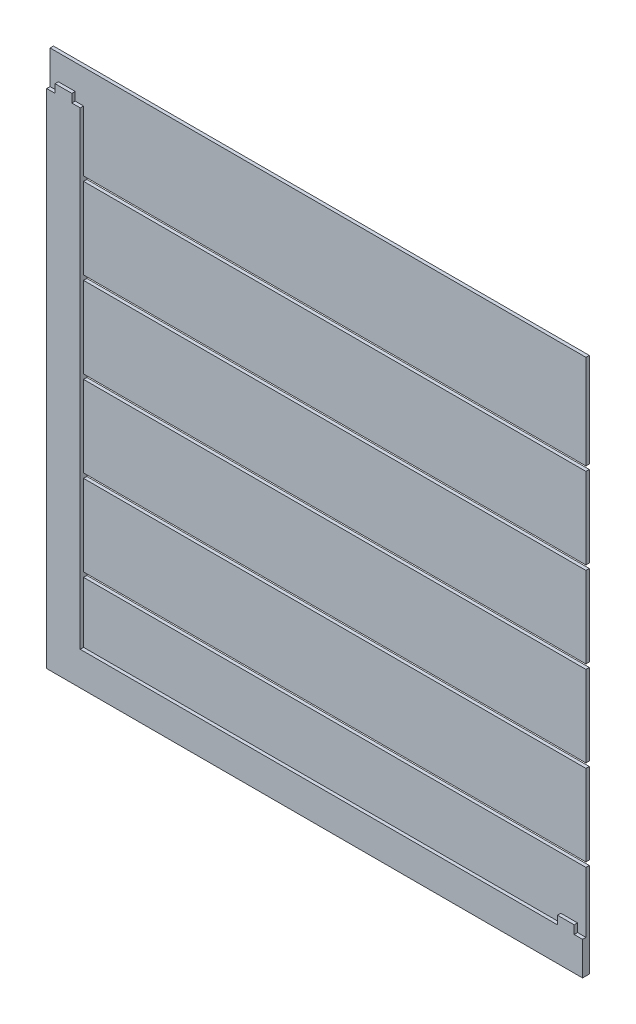
ISO-10303-21;
HEADER;
FILE_DESCRIPTION(('STEP AP214'),'2;1');
FILE_NAME('part.step','',(''),(''),'','','');
FILE_SCHEMA(('AUTOMOTIVE_DESIGN { 1 0 10303 214 1 1 1 1 }'));
ENDSEC;
DATA;
#1=APPLICATION_CONTEXT('core data for automotive mechanical design processes');
#2=APPLICATION_PROTOCOL_DEFINITION('international standard','automotive_design',2000,#1);
#3=PRODUCT_CONTEXT('',#1,'mechanical');
#4=PRODUCT('Part','Part','',(#3));
#5=PRODUCT_RELATED_PRODUCT_CATEGORY('part','',(#4));
#6=PRODUCT_DEFINITION_FORMATION('','',#4);
#7=PRODUCT_DEFINITION_CONTEXT('part definition',#1,'design');
#8=PRODUCT_DEFINITION('design','',#6,#7);
#9=PRODUCT_DEFINITION_SHAPE('','',#8);
#10=(LENGTH_UNIT() NAMED_UNIT(*) SI_UNIT(.MILLI.,.METRE.));
#11=(NAMED_UNIT(*) PLANE_ANGLE_UNIT() SI_UNIT($,.RADIAN.));
#12=(NAMED_UNIT(*) SI_UNIT($,.STERADIAN.) SOLID_ANGLE_UNIT());
#13=UNCERTAINTY_MEASURE_WITH_UNIT(LENGTH_MEASURE(1.E-05),#10,'distance_accuracy_value','');
#14=(GEOMETRIC_REPRESENTATION_CONTEXT(3) GLOBAL_UNCERTAINTY_ASSIGNED_CONTEXT((#13)) GLOBAL_UNIT_ASSIGNED_CONTEXT((#10,
#11,#12)) REPRESENTATION_CONTEXT('',''));
#15=CARTESIAN_POINT('',(0.,0.,0.));
#16=DIRECTION('',(0.,0.,1.));
#17=DIRECTION('',(1.,0.,0.));
#18=AXIS2_PLACEMENT_3D('',#15,#16,#17);
#19=CARTESIAN_POINT('',(0.,0.,1.));
#20=DIRECTION('',(0.,0.,1.));
#21=DIRECTION('',(1.,0.,0.));
#22=AXIS2_PLACEMENT_3D('',#19,#20,#21);
#23=PLANE('',#22);
#24=DIRECTION('',(0.,1.,0.));
#25=VECTOR('',#24,1.);
#26=CARTESIAN_POINT('',(-75.,-70.0313827048751,1.));
#27=LINE('',#26,#25);
#28=CARTESIAN_POINT('',(-75.,-50.5313827048751,1.));
#29=VERTEX_POINT('',#28);
#30=CARTESIAN_POINT('',(-75.,-26.3313827048751,1.));
#31=VERTEX_POINT('',#30);
#32=EDGE_CURVE('E11',#29,#31,#27,.T.);
#33=ORIENTED_EDGE('',*,*,#32,.F.);
#34=DIRECTION('',(1.,0.,0.));
#35=VECTOR('',#34,1.);
#36=CARTESIAN_POINT('',(0.,-50.5313827048751,1.));
#37=LINE('',#36,#35);
#38=CARTESIAN_POINT('',(75.,-50.5313827048751,1.));
#39=VERTEX_POINT('',#38);
#40=EDGE_CURVE('E390',#29,#39,#37,.T.);
#41=ORIENTED_EDGE('',*,*,#40,.T.);
#42=DIRECTION('',(0.,-1.,0.));
#43=VECTOR('',#42,1.);
#44=CARTESIAN_POINT('',(75.,0.,1.));
#45=LINE('',#44,#43);
#46=CARTESIAN_POINT('',(75.,-26.3313827048751,1.));
#47=VERTEX_POINT('',#46);
#48=EDGE_CURVE('E393',#47,#39,#45,.T.);
#49=ORIENTED_EDGE('',*,*,#48,.F.);
#50=DIRECTION('',(1.,0.,0.));
#51=VECTOR('',#50,1.);
#52=CARTESIAN_POINT('',(0.,-26.3313827048751,1.));
#53=LINE('',#52,#51);
#54=EDGE_CURVE('E396',#31,#47,#53,.T.);
#55=ORIENTED_EDGE('',*,*,#54,.F.);
#56=EDGE_LOOP('',(#33,#41,#49,#55));
#57=FACE_BOUND('',#56,.T.);
#58=ADVANCED_FACE('F39',(#57),#23,.T.);
#59=CARTESIAN_POINT('',(-75.,-24.9313827048751,1.));
#60=VERTEX_POINT('',#59);
#61=CARTESIAN_POINT('',(-75.,-0.731382704875112,1.));
#62=VERTEX_POINT('',#61);
#63=EDGE_CURVE('E48',#60,#62,#27,.T.);
#64=ORIENTED_EDGE('',*,*,#63,.F.);
#65=DIRECTION('',(1.,0.,0.));
#66=VECTOR('',#65,1.);
#67=CARTESIAN_POINT('',(0.,-24.9313827048751,1.));
#68=LINE('',#67,#66);
#69=CARTESIAN_POINT('',(75.,-24.9313827048751,1.));
#70=VERTEX_POINT('',#69);
#71=EDGE_CURVE('E399',#60,#70,#68,.T.);
#72=ORIENTED_EDGE('',*,*,#71,.T.);
#73=DIRECTION('',(0.,-1.,0.));
#74=VECTOR('',#73,1.);
#75=CARTESIAN_POINT('',(75.,0.,1.));
#76=LINE('',#75,#74);
#77=CARTESIAN_POINT('',(75.,-0.731382704875112,1.));
#78=VERTEX_POINT('',#77);
#79=EDGE_CURVE('E401',#78,#70,#76,.T.);
#80=ORIENTED_EDGE('',*,*,#79,.F.);
#81=DIRECTION('',(1.,0.,0.));
#82=VECTOR('',#81,1.);
#83=CARTESIAN_POINT('',(0.,-0.731382704875112,1.));
#84=LINE('',#83,#82);
#85=EDGE_CURVE('E404',#62,#78,#84,.T.);
#86=ORIENTED_EDGE('',*,*,#85,.F.);
#87=EDGE_LOOP('',(#64,#72,#80,#86));
#88=FACE_BOUND('',#87,.T.);
#89=ADVANCED_FACE('F562',(#88),#23,.T.);
#90=CARTESIAN_POINT('',(-75.,0.668617295124886,1.));
#91=VERTEX_POINT('',#90);
#92=CARTESIAN_POINT('',(-75.,24.8686172951249,1.));
#93=VERTEX_POINT('',#92);
#94=EDGE_CURVE('E551',#91,#93,#27,.T.);
#95=ORIENTED_EDGE('',*,*,#94,.F.);
#96=DIRECTION('',(1.,0.,0.));
#97=VECTOR('',#96,1.);
#98=CARTESIAN_POINT('',(0.,0.668617295124886,1.));
#99=LINE('',#98,#97);
#100=CARTESIAN_POINT('',(75.,0.668617295124886,1.));
#101=VERTEX_POINT('',#100);
#102=EDGE_CURVE('E407',#91,#101,#99,.T.);
#103=ORIENTED_EDGE('',*,*,#102,.T.);
#104=DIRECTION('',(0.,-1.,0.));
#105=VECTOR('',#104,1.);
#106=CARTESIAN_POINT('',(75.,0.,1.));
#107=LINE('',#106,#105);
#108=CARTESIAN_POINT('',(75.,24.8686172951249,1.));
#109=VERTEX_POINT('',#108);
#110=EDGE_CURVE('E409',#109,#101,#107,.T.);
#111=ORIENTED_EDGE('',*,*,#110,.F.);
#112=DIRECTION('',(1.,0.,0.));
#113=VECTOR('',#112,1.);
#114=CARTESIAN_POINT('',(0.,24.8686172951249,1.));
#115=LINE('',#114,#113);
#116=EDGE_CURVE('E412',#93,#109,#115,.T.);
#117=ORIENTED_EDGE('',*,*,#116,.F.);
#118=EDGE_LOOP('',(#95,#103,#111,#117));
#119=FACE_BOUND('',#118,.T.);
#120=ADVANCED_FACE('F579',(#119),#23,.T.);
#121=CARTESIAN_POINT('',(-75.,26.2686172951249,1.));
#122=VERTEX_POINT('',#121);
#123=CARTESIAN_POINT('',(-75.,50.4686172951249,1.));
#124=VERTEX_POINT('',#123);
#125=EDGE_CURVE('E547',#122,#124,#27,.T.);
#126=ORIENTED_EDGE('',*,*,#125,.F.);
#127=DIRECTION('',(1.,0.,0.));
#128=VECTOR('',#127,1.);
#129=CARTESIAN_POINT('',(0.,26.2686172951249,1.));
#130=LINE('',#129,#128);
#131=CARTESIAN_POINT('',(75.,26.2686172951249,1.));
#132=VERTEX_POINT('',#131);
#133=EDGE_CURVE('E415',#122,#132,#130,.T.);
#134=ORIENTED_EDGE('',*,*,#133,.T.);
#135=DIRECTION('',(0.,-1.,0.));
#136=VECTOR('',#135,1.);
#137=CARTESIAN_POINT('',(75.,0.,1.));
#138=LINE('',#137,#136);
#139=CARTESIAN_POINT('',(75.,50.4686172951249,1.));
#140=VERTEX_POINT('',#139);
#141=EDGE_CURVE('E417',#140,#132,#138,.T.);
#142=ORIENTED_EDGE('',*,*,#141,.F.);
#143=DIRECTION('',(1.,0.,0.));
#144=VECTOR('',#143,1.);
#145=CARTESIAN_POINT('',(0.,50.4686172951249,1.));
#146=LINE('',#145,#144);
#147=EDGE_CURVE('E420',#124,#140,#146,.T.);
#148=ORIENTED_EDGE('',*,*,#147,.F.);
#149=EDGE_LOOP('',(#126,#134,#142,#148));
#150=FACE_BOUND('',#149,.T.);
#151=ADVANCED_FACE('F594',(#150),#23,.T.);
#152=DIRECTION('',(-1.,0.,0.));
#153=VECTOR('',#152,1.);
#154=CARTESIAN_POINT('',(-85.,69.9686172951249,1.));
#155=LINE('',#154,#153);
#156=CARTESIAN_POINT('',(-82.5,69.9686172951249,1.));
#157=VERTEX_POINT('',#156);
#158=CARTESIAN_POINT('',(-85.,69.9686172951249,1.));
#159=VERTEX_POINT('',#158);
#160=EDGE_CURVE('E57',#157,#159,#155,.T.);
#161=ORIENTED_EDGE('',*,*,#160,.F.);
#162=DIRECTION('',(0.,-1.,0.));
#163=VECTOR('',#162,1.);
#164=CARTESIAN_POINT('',(-82.5,69.9686172951249,1.));
#165=LINE('',#164,#163);
#166=CARTESIAN_POINT('',(-82.5,72.468617295125,1.));
#167=VERTEX_POINT('',#166);
#168=EDGE_CURVE('E61',#167,#157,#165,.T.);
#169=ORIENTED_EDGE('',*,*,#168,.F.);
#170=DIRECTION('',(-1.,0.,0.));
#171=VECTOR('',#170,1.);
#172=CARTESIAN_POINT('',(-82.5,72.468617295125,1.));
#173=LINE('',#172,#171);
#174=CARTESIAN_POINT('',(-77.5,72.468617295125,1.));
#175=VERTEX_POINT('',#174);
#176=EDGE_CURVE('E350',#175,#167,#173,.T.);
#177=ORIENTED_EDGE('',*,*,#176,.F.);
#178=DIRECTION('',(0.,1.,0.));
#179=VECTOR('',#178,1.);
#180=CARTESIAN_POINT('',(-77.5,69.9686172951249,1.));
#181=LINE('',#180,#179);
#182=CARTESIAN_POINT('',(-77.5,69.9686172951249,1.));
#183=VERTEX_POINT('',#182);
#184=EDGE_CURVE('E347',#183,#175,#181,.T.);
#185=ORIENTED_EDGE('',*,*,#184,.F.);
#186=DIRECTION('',(-1.,0.,0.));
#187=VECTOR('',#186,1.);
#188=CARTESIAN_POINT('',(-77.5,69.9686172951249,1.));
#189=LINE('',#188,#187);
#190=CARTESIAN_POINT('',(-75.,69.9686172951249,1.));
#191=VERTEX_POINT('',#190);
#192=EDGE_CURVE('E343',#191,#183,#189,.T.);
#193=ORIENTED_EDGE('',*,*,#192,.F.);
#194=CARTESIAN_POINT('',(-75.,51.8686172951249,1.));
#195=VERTEX_POINT('',#194);
#196=EDGE_CURVE('E344',#195,#191,#27,.T.);
#197=ORIENTED_EDGE('',*,*,#196,.F.);
#198=DIRECTION('',(1.,0.,0.));
#199=VECTOR('',#198,1.);
#200=CARTESIAN_POINT('',(0.,51.8686172951249,1.));
#201=LINE('',#200,#199);
#202=CARTESIAN_POINT('',(75.,51.8686172951249,1.));
#203=VERTEX_POINT('',#202);
#204=EDGE_CURVE('E423',#195,#203,#201,.T.);
#205=ORIENTED_EDGE('',*,*,#204,.T.);
#206=DIRECTION('',(0.,-1.,0.));
#207=VECTOR('',#206,1.);
#208=CARTESIAN_POINT('',(75.,0.,1.));
#209=LINE('',#208,#207);
#210=CARTESIAN_POINT('',(75.,79.9686172951249,1.));
#211=VERTEX_POINT('',#210);
#212=EDGE_CURVE('E425',#211,#203,#209,.T.);
#213=ORIENTED_EDGE('',*,*,#212,.F.);
#214=DIRECTION('',(-1.,0.,0.));
#215=VECTOR('',#214,1.);
#216=CARTESIAN_POINT('',(0.,79.9686172951249,1.));
#217=LINE('',#216,#215);
#218=CARTESIAN_POINT('',(-85.,79.9686172951249,1.));
#219=VERTEX_POINT('',#218);
#220=EDGE_CURVE('E428',#211,#219,#217,.T.);
#221=ORIENTED_EDGE('',*,*,#220,.T.);
#222=DIRECTION('',(0.,-1.,0.));
#223=VECTOR('',#222,1.);
#224=CARTESIAN_POINT('',(-85.,0.,1.));
#225=LINE('',#224,#223);
#226=EDGE_CURVE('E430',#219,#159,#225,.T.);
#227=ORIENTED_EDGE('',*,*,#226,.T.);
#228=EDGE_LOOP('',(#161,#169,#177,#185,#193,#197,#205,#213,#221,#227));
#229=FACE_BOUND('',#228,.T.);
#230=ADVANCED_FACE('F608',(#229),#23,.T.);
#231=CARTESIAN_POINT('',(0.,-51.9313827048751,1.));
#232=DIRECTION('',(0.,1.,0.));
#233=DIRECTION('',(0.,0.,1.));
#234=AXIS2_PLACEMENT_3D('',#231,#232,#233);
#235=PLANE('',#234);
#236=DIRECTION('',(1.,0.,0.));
#237=VECTOR('',#236,1.);
#238=CARTESIAN_POINT('',(0.,-51.9313827048751,0.));
#239=LINE('',#238,#237);
#240=CARTESIAN_POINT('',(-75.,-51.9313827048751,0.));
#241=VERTEX_POINT('',#240);
#242=CARTESIAN_POINT('',(75.,-51.9313827048751,0.));
#243=VERTEX_POINT('',#242);
#244=EDGE_CURVE('E386',#241,#243,#239,.T.);
#245=ORIENTED_EDGE('',*,*,#244,.F.);
#246=DIRECTION('',(0.,0.,-1.));
#247=VECTOR('',#246,1.);
#248=CARTESIAN_POINT('',(-75.,-51.9313827048751,1.));
#249=LINE('',#248,#247);
#250=CARTESIAN_POINT('',(-75.,-51.9313827048751,1.));
#251=VERTEX_POINT('',#250);
#252=EDGE_CURVE('E43',#251,#241,#249,.T.);
#253=ORIENTED_EDGE('',*,*,#252,.F.);
#254=DIRECTION('',(1.,0.,0.));
#255=VECTOR('',#254,1.);
#256=CARTESIAN_POINT('',(0.,-51.9313827048751,1.));
#257=LINE('',#256,#255);
#258=CARTESIAN_POINT('',(75.,-51.9313827048751,1.));
#259=VERTEX_POINT('',#258);
#260=EDGE_CURVE('E387',#251,#259,#257,.T.);
#261=ORIENTED_EDGE('',*,*,#260,.T.);
#262=DIRECTION('',(0.,0.,-1.));
#263=VECTOR('',#262,1.);
#264=CARTESIAN_POINT('',(75.,-51.9313827048751,1.));
#265=LINE('',#264,#263);
#266=EDGE_CURVE('E285',#259,#243,#265,.T.);
#267=ORIENTED_EDGE('',*,*,#266,.T.);
#268=EDGE_LOOP('',(#245,#253,#261,#267));
#269=FACE_BOUND('',#268,.T.);
#270=ADVANCED_FACE('F41',(#269),#235,.T.);
#271=CARTESIAN_POINT('',(0.,-50.5313827048751,1.));
#272=DIRECTION('',(0.,1.,0.));
#273=DIRECTION('',(0.,0.,1.));
#274=AXIS2_PLACEMENT_3D('',#271,#272,#273);
#275=PLANE('',#274);
#276=DIRECTION('',(1.,0.,0.));
#277=VECTOR('',#276,1.);
#278=CARTESIAN_POINT('',(0.,-50.5313827048751,0.));
#279=LINE('',#278,#277);
#280=CARTESIAN_POINT('',(-75.,-50.5313827048751,0.));
#281=VERTEX_POINT('',#280);
#282=CARTESIAN_POINT('',(75.,-50.5313827048751,0.));
#283=VERTEX_POINT('',#282);
#284=EDGE_CURVE('E438',#281,#283,#279,.T.);
#285=ORIENTED_EDGE('',*,*,#284,.T.);
#286=DIRECTION('',(0.,0.,-1.));
#287=VECTOR('',#286,1.);
#288=CARTESIAN_POINT('',(75.,-50.5313827048751,1.));
#289=LINE('',#288,#287);
#290=EDGE_CURVE('E537',#39,#283,#289,.T.);
#291=ORIENTED_EDGE('',*,*,#290,.F.);
#292=ORIENTED_EDGE('',*,*,#40,.F.);
#293=DIRECTION('',(0.,0.,-1.));
#294=VECTOR('',#293,1.);
#295=CARTESIAN_POINT('',(-75.,-50.5313827048751,1.));
#296=LINE('',#295,#294);
#297=EDGE_CURVE('E538',#29,#281,#296,.T.);
#298=ORIENTED_EDGE('',*,*,#297,.T.);
#299=EDGE_LOOP('',(#285,#291,#292,#298));
#300=FACE_BOUND('',#299,.T.);
#301=ADVANCED_FACE('F646',(#300),#275,.F.);
#302=CARTESIAN_POINT('',(75.,0.,1.));
#303=DIRECTION('',(1.,0.,0.));
#304=DIRECTION('',(0.,0.,-1.));
#305=AXIS2_PLACEMENT_3D('',#302,#303,#304);
#306=PLANE('',#305);
#307=DIRECTION('',(0.,-1.,0.));
#308=VECTOR('',#307,1.);
#309=CARTESIAN_POINT('',(75.,0.,0.));
#310=LINE('',#309,#308);
#311=CARTESIAN_POINT('',(75.,-26.3313827048751,0.));
#312=VERTEX_POINT('',#311);
#313=EDGE_CURVE('E441',#312,#283,#310,.T.);
#314=ORIENTED_EDGE('',*,*,#313,.F.);
#315=DIRECTION('',(0.,0.,-1.));
#316=VECTOR('',#315,1.);
#317=CARTESIAN_POINT('',(75.,-26.3313827048751,1.));
#318=LINE('',#317,#316);
#319=EDGE_CURVE('E535',#47,#312,#318,.T.);
#320=ORIENTED_EDGE('',*,*,#319,.F.);
#321=ORIENTED_EDGE('',*,*,#48,.T.);
#322=ORIENTED_EDGE('',*,*,#290,.T.);
#323=EDGE_LOOP('',(#314,#320,#321,#322));
#324=FACE_BOUND('',#323,.T.);
#325=ADVANCED_FACE('F772',(#324),#306,.T.);
#326=CARTESIAN_POINT('',(0.,-26.3313827048751,1.));
#327=DIRECTION('',(0.,1.,0.));
#328=DIRECTION('',(0.,0.,1.));
#329=AXIS2_PLACEMENT_3D('',#326,#327,#328);
#330=PLANE('',#329);
#331=DIRECTION('',(1.,0.,0.));
#332=VECTOR('',#331,1.);
#333=CARTESIAN_POINT('',(0.,-26.3313827048751,0.));
#334=LINE('',#333,#332);
#335=CARTESIAN_POINT('',(-75.,-26.3313827048751,0.));
#336=VERTEX_POINT('',#335);
#337=EDGE_CURVE('E444',#336,#312,#334,.T.);
#338=ORIENTED_EDGE('',*,*,#337,.F.);
#339=DIRECTION('',(0.,0.,-1.));
#340=VECTOR('',#339,1.);
#341=CARTESIAN_POINT('',(-75.,-26.3313827048751,1.));
#342=LINE('',#341,#340);
#343=EDGE_CURVE('E533',#31,#336,#342,.T.);
#344=ORIENTED_EDGE('',*,*,#343,.F.);
#345=ORIENTED_EDGE('',*,*,#54,.T.);
#346=ORIENTED_EDGE('',*,*,#319,.T.);
#347=EDGE_LOOP('',(#338,#344,#345,#346));
#348=FACE_BOUND('',#347,.T.);
#349=ADVANCED_FACE('F652',(#348),#330,.T.);
#350=CARTESIAN_POINT('',(0.,-24.9313827048751,1.));
#351=DIRECTION('',(0.,1.,0.));
#352=DIRECTION('',(0.,0.,1.));
#353=AXIS2_PLACEMENT_3D('',#350,#351,#352);
#354=PLANE('',#353);
#355=DIRECTION('',(1.,0.,0.));
#356=VECTOR('',#355,1.);
#357=CARTESIAN_POINT('',(0.,-24.9313827048751,0.));
#358=LINE('',#357,#356);
#359=CARTESIAN_POINT('',(-75.,-24.9313827048751,0.));
#360=VERTEX_POINT('',#359);
#361=CARTESIAN_POINT('',(75.,-24.9313827048751,0.));
#362=VERTEX_POINT('',#361);
#363=EDGE_CURVE('E449',#360,#362,#358,.T.);
#364=ORIENTED_EDGE('',*,*,#363,.T.);
#365=DIRECTION('',(0.,0.,-1.));
#366=VECTOR('',#365,1.);
#367=CARTESIAN_POINT('',(75.,-24.9313827048751,1.));
#368=LINE('',#367,#366);
#369=EDGE_CURVE('E528',#70,#362,#368,.T.);
#370=ORIENTED_EDGE('',*,*,#369,.F.);
#371=ORIENTED_EDGE('',*,*,#71,.F.);
#372=DIRECTION('',(0.,0.,-1.));
#373=VECTOR('',#372,1.);
#374=CARTESIAN_POINT('',(-75.,-24.9313827048751,1.));
#375=LINE('',#374,#373);
#376=EDGE_CURVE('E530',#60,#360,#375,.T.);
#377=ORIENTED_EDGE('',*,*,#376,.T.);
#378=EDGE_LOOP('',(#364,#370,#371,#377));
#379=FACE_BOUND('',#378,.T.);
#380=ADVANCED_FACE('F656',(#379),#354,.F.);
#381=CARTESIAN_POINT('',(75.,0.,1.));
#382=DIRECTION('',(1.,0.,0.));
#383=DIRECTION('',(0.,1.,0.));
#384=AXIS2_PLACEMENT_3D('',#381,#382,#383);
#385=PLANE('',#384);
#386=DIRECTION('',(0.,-1.,0.));
#387=VECTOR('',#386,1.);
#388=CARTESIAN_POINT('',(75.,0.,0.));
#389=LINE('',#388,#387);
#390=CARTESIAN_POINT('',(75.,-0.731382704875112,0.));
#391=VERTEX_POINT('',#390);
#392=EDGE_CURVE('E452',#391,#362,#389,.T.);
#393=ORIENTED_EDGE('',*,*,#392,.F.);
#394=DIRECTION('',(0.,0.,-1.));
#395=VECTOR('',#394,1.);
#396=CARTESIAN_POINT('',(75.,-0.731382704875112,1.));
#397=LINE('',#396,#395);
#398=EDGE_CURVE('E526',#78,#391,#397,.T.);
#399=ORIENTED_EDGE('',*,*,#398,.F.);
#400=ORIENTED_EDGE('',*,*,#79,.T.);
#401=ORIENTED_EDGE('',*,*,#369,.T.);
#402=EDGE_LOOP('',(#393,#399,#400,#401));
#403=FACE_BOUND('',#402,.T.);
#404=ADVANCED_FACE('F658',(#403),#385,.T.);
#405=CARTESIAN_POINT('',(0.,-0.731382704875112,1.));
#406=DIRECTION('',(0.,1.,0.));
#407=DIRECTION('',(0.,0.,1.));
#408=AXIS2_PLACEMENT_3D('',#405,#406,#407);
#409=PLANE('',#408);
#410=DIRECTION('',(1.,0.,0.));
#411=VECTOR('',#410,1.);
#412=CARTESIAN_POINT('',(0.,-0.731382704875112,0.));
#413=LINE('',#412,#411);
#414=CARTESIAN_POINT('',(-75.,-0.731382704875112,0.));
#415=VERTEX_POINT('',#414);
#416=EDGE_CURVE('E455',#415,#391,#413,.T.);
#417=ORIENTED_EDGE('',*,*,#416,.F.);
#418=DIRECTION('',(0.,0.,-1.));
#419=VECTOR('',#418,1.);
#420=CARTESIAN_POINT('',(-75.,-0.731382704875112,1.));
#421=LINE('',#420,#419);
#422=EDGE_CURVE('E524',#62,#415,#421,.T.);
#423=ORIENTED_EDGE('',*,*,#422,.F.);
#424=ORIENTED_EDGE('',*,*,#85,.T.);
#425=ORIENTED_EDGE('',*,*,#398,.T.);
#426=EDGE_LOOP('',(#417,#423,#424,#425));
#427=FACE_BOUND('',#426,.T.);
#428=ADVANCED_FACE('F567',(#427),#409,.T.);
#429=CARTESIAN_POINT('',(0.,0.668617295124886,1.));
#430=DIRECTION('',(0.,1.,0.));
#431=DIRECTION('',(0.,0.,1.));
#432=AXIS2_PLACEMENT_3D('',#429,#430,#431);
#433=PLANE('',#432);
#434=DIRECTION('',(1.,0.,0.));
#435=VECTOR('',#434,1.);
#436=CARTESIAN_POINT('',(0.,0.668617295124886,0.));
#437=LINE('',#436,#435);
#438=CARTESIAN_POINT('',(-75.,0.668617295124886,0.));
#439=VERTEX_POINT('',#438);
#440=CARTESIAN_POINT('',(75.,0.668617295124886,0.));
#441=VERTEX_POINT('',#440);
#442=EDGE_CURVE('E460',#439,#441,#437,.T.);
#443=ORIENTED_EDGE('',*,*,#442,.T.);
#444=DIRECTION('',(0.,0.,-1.));
#445=VECTOR('',#444,1.);
#446=CARTESIAN_POINT('',(75.,0.668617295124886,1.));
#447=LINE('',#446,#445);
#448=EDGE_CURVE('E519',#101,#441,#447,.T.);
#449=ORIENTED_EDGE('',*,*,#448,.F.);
#450=ORIENTED_EDGE('',*,*,#102,.F.);
#451=DIRECTION('',(0.,0.,-1.));
#452=VECTOR('',#451,1.);
#453=CARTESIAN_POINT('',(-75.,0.668617295124886,1.));
#454=LINE('',#453,#452);
#455=EDGE_CURVE('E521',#91,#439,#454,.T.);
#456=ORIENTED_EDGE('',*,*,#455,.T.);
#457=EDGE_LOOP('',(#443,#449,#450,#456));
#458=FACE_BOUND('',#457,.T.);
#459=ADVANCED_FACE('F575',(#458),#433,.F.);
#460=CARTESIAN_POINT('',(75.,0.,1.));
#461=DIRECTION('',(1.,0.,0.));
#462=DIRECTION('',(0.,0.,-1.));
#463=AXIS2_PLACEMENT_3D('',#460,#461,#462);
#464=PLANE('',#463);
#465=DIRECTION('',(0.,-1.,0.));
#466=VECTOR('',#465,1.);
#467=CARTESIAN_POINT('',(75.,0.,0.));
#468=LINE('',#467,#466);
#469=CARTESIAN_POINT('',(75.,24.8686172951249,0.));
#470=VERTEX_POINT('',#469);
#471=EDGE_CURVE('E463',#470,#441,#468,.T.);
#472=ORIENTED_EDGE('',*,*,#471,.F.);
#473=DIRECTION('',(0.,0.,-1.));
#474=VECTOR('',#473,1.);
#475=CARTESIAN_POINT('',(75.,24.8686172951249,1.));
#476=LINE('',#475,#474);
#477=EDGE_CURVE('E517',#109,#470,#476,.T.);
#478=ORIENTED_EDGE('',*,*,#477,.F.);
#479=ORIENTED_EDGE('',*,*,#110,.T.);
#480=ORIENTED_EDGE('',*,*,#448,.T.);
#481=EDGE_LOOP('',(#472,#478,#479,#480));
#482=FACE_BOUND('',#481,.T.);
#483=ADVANCED_FACE('F752',(#482),#464,.T.);
#484=CARTESIAN_POINT('',(0.,24.8686172951249,1.));
#485=DIRECTION('',(0.,1.,0.));
#486=DIRECTION('',(0.,0.,1.));
#487=AXIS2_PLACEMENT_3D('',#484,#485,#486);
#488=PLANE('',#487);
#489=DIRECTION('',(1.,0.,0.));
#490=VECTOR('',#489,1.);
#491=CARTESIAN_POINT('',(0.,24.8686172951249,0.));
#492=LINE('',#491,#490);
#493=CARTESIAN_POINT('',(-75.,24.8686172951249,0.));
#494=VERTEX_POINT('',#493);
#495=EDGE_CURVE('E466',#494,#470,#492,.T.);
#496=ORIENTED_EDGE('',*,*,#495,.F.);
#497=DIRECTION('',(0.,0.,-1.));
#498=VECTOR('',#497,1.);
#499=CARTESIAN_POINT('',(-75.,24.8686172951249,1.));
#500=LINE('',#499,#498);
#501=EDGE_CURVE('E515',#93,#494,#500,.T.);
#502=ORIENTED_EDGE('',*,*,#501,.F.);
#503=ORIENTED_EDGE('',*,*,#116,.T.);
#504=ORIENTED_EDGE('',*,*,#477,.T.);
#505=EDGE_LOOP('',(#496,#502,#503,#504));
#506=FACE_BOUND('',#505,.T.);
#507=ADVANCED_FACE('F583',(#506),#488,.T.);
#508=CARTESIAN_POINT('',(0.,26.2686172951249,1.));
#509=DIRECTION('',(0.,1.,0.));
#510=DIRECTION('',(0.,0.,1.));
#511=AXIS2_PLACEMENT_3D('',#508,#509,#510);
#512=PLANE('',#511);
#513=DIRECTION('',(1.,0.,0.));
#514=VECTOR('',#513,1.);
#515=CARTESIAN_POINT('',(0.,26.2686172951249,0.));
#516=LINE('',#515,#514);
#517=CARTESIAN_POINT('',(-75.,26.2686172951249,0.));
#518=VERTEX_POINT('',#517);
#519=CARTESIAN_POINT('',(75.,26.2686172951249,0.));
#520=VERTEX_POINT('',#519);
#521=EDGE_CURVE('E471',#518,#520,#516,.T.);
#522=ORIENTED_EDGE('',*,*,#521,.T.);
#523=DIRECTION('',(0.,0.,-1.));
#524=VECTOR('',#523,1.);
#525=CARTESIAN_POINT('',(75.,26.2686172951249,1.));
#526=LINE('',#525,#524);
#527=EDGE_CURVE('E510',#132,#520,#526,.T.);
#528=ORIENTED_EDGE('',*,*,#527,.F.);
#529=ORIENTED_EDGE('',*,*,#133,.F.);
#530=DIRECTION('',(0.,0.,-1.));
#531=VECTOR('',#530,1.);
#532=CARTESIAN_POINT('',(-75.,26.2686172951249,1.));
#533=LINE('',#532,#531);
#534=EDGE_CURVE('E512',#122,#518,#533,.T.);
#535=ORIENTED_EDGE('',*,*,#534,.T.);
#536=EDGE_LOOP('',(#522,#528,#529,#535));
#537=FACE_BOUND('',#536,.T.);
#538=ADVANCED_FACE('F590',(#537),#512,.F.);
#539=CARTESIAN_POINT('',(75.,0.,1.));
#540=DIRECTION('',(1.,0.,0.));
#541=DIRECTION('',(0.,0.,-1.));
#542=AXIS2_PLACEMENT_3D('',#539,#540,#541);
#543=PLANE('',#542);
#544=DIRECTION('',(0.,-1.,0.));
#545=VECTOR('',#544,1.);
#546=CARTESIAN_POINT('',(75.,0.,0.));
#547=LINE('',#546,#545);
#548=CARTESIAN_POINT('',(75.,50.4686172951249,0.));
#549=VERTEX_POINT('',#548);
#550=EDGE_CURVE('E474',#549,#520,#547,.T.);
#551=ORIENTED_EDGE('',*,*,#550,.F.);
#552=DIRECTION('',(0.,0.,-1.));
#553=VECTOR('',#552,1.);
#554=CARTESIAN_POINT('',(75.,50.4686172951249,1.));
#555=LINE('',#554,#553);
#556=EDGE_CURVE('E508',#140,#549,#555,.T.);
#557=ORIENTED_EDGE('',*,*,#556,.F.);
#558=ORIENTED_EDGE('',*,*,#141,.T.);
#559=ORIENTED_EDGE('',*,*,#527,.T.);
#560=EDGE_LOOP('',(#551,#557,#558,#559));
#561=FACE_BOUND('',#560,.T.);
#562=ADVANCED_FACE('F738',(#561),#543,.T.);
#563=CARTESIAN_POINT('',(0.,50.4686172951249,1.));
#564=DIRECTION('',(0.,1.,0.));
#565=DIRECTION('',(0.,0.,1.));
#566=AXIS2_PLACEMENT_3D('',#563,#564,#565);
#567=PLANE('',#566);
#568=DIRECTION('',(1.,0.,0.));
#569=VECTOR('',#568,1.);
#570=CARTESIAN_POINT('',(0.,50.4686172951249,0.));
#571=LINE('',#570,#569);
#572=CARTESIAN_POINT('',(-75.,50.4686172951249,0.));
#573=VERTEX_POINT('',#572);
#574=EDGE_CURVE('E477',#573,#549,#571,.T.);
#575=ORIENTED_EDGE('',*,*,#574,.F.);
#576=DIRECTION('',(0.,0.,-1.));
#577=VECTOR('',#576,1.);
#578=CARTESIAN_POINT('',(-75.,50.4686172951249,1.));
#579=LINE('',#578,#577);
#580=EDGE_CURVE('E506',#124,#573,#579,.T.);
#581=ORIENTED_EDGE('',*,*,#580,.F.);
#582=ORIENTED_EDGE('',*,*,#147,.T.);
#583=ORIENTED_EDGE('',*,*,#556,.T.);
#584=EDGE_LOOP('',(#575,#581,#582,#583));
#585=FACE_BOUND('',#584,.T.);
#586=ADVANCED_FACE('F598',(#585),#567,.T.);
#587=CARTESIAN_POINT('',(-75.,0.,1.));
#588=DIRECTION('',(-1.,0.,0.));
#589=DIRECTION('',(0.,0.,1.));
#590=AXIS2_PLACEMENT_3D('',#587,#588,#589);
#591=PLANE('',#590);
#592=DIRECTION('',(0.,1.,0.));
#593=VECTOR('',#592,1.);
#594=CARTESIAN_POINT('',(-75.,0.,0.));
#595=LINE('',#594,#593);
#596=CARTESIAN_POINT('',(-75.,51.8686172951249,0.));
#597=VERTEX_POINT('',#596);
#598=EDGE_CURVE('E480',#573,#597,#595,.T.);
#599=ORIENTED_EDGE('',*,*,#598,.T.);
#600=DIRECTION('',(0.,0.,-1.));
#601=VECTOR('',#600,1.);
#602=CARTESIAN_POINT('',(-75.,51.8686172951249,1.));
#603=LINE('',#602,#601);
#604=EDGE_CURVE('E503',#195,#597,#603,.T.);
#605=ORIENTED_EDGE('',*,*,#604,.F.);
#606=ORIENTED_EDGE('',*,*,#196,.T.);
#607=DIRECTION('',(0.,0.,-1.));
#608=VECTOR('',#607,1.);
#609=CARTESIAN_POINT('',(-75.,69.9686172951249,2.));
#610=LINE('',#609,#608);
#611=CARTESIAN_POINT('',(-75.,69.9686172951249,2.));
#612=VERTEX_POINT('',#611);
#613=EDGE_CURVE('E367',#612,#191,#610,.T.);
#614=ORIENTED_EDGE('',*,*,#613,.F.);
#615=DIRECTION('',(0.,1.,0.));
#616=VECTOR('',#615,1.);
#617=CARTESIAN_POINT('',(-75.,-70.0313827048751,2.));
#618=LINE('',#617,#616);
#619=CARTESIAN_POINT('',(-75.,-70.0313827048751,2.));
#620=VERTEX_POINT('',#619);
#621=EDGE_CURVE('E313',#620,#612,#618,.T.);
#622=ORIENTED_EDGE('',*,*,#621,.F.);
#623=DIRECTION('',(0.,0.,-1.));
#624=VECTOR('',#623,1.);
#625=CARTESIAN_POINT('',(-75.,-70.0313827048751,2.));
#626=LINE('',#625,#624);
#627=CARTESIAN_POINT('',(-75.,-70.0313827048751,1.));
#628=VERTEX_POINT('',#627);
#629=EDGE_CURVE('E370',#620,#628,#626,.T.);
#630=ORIENTED_EDGE('',*,*,#629,.T.);
#631=EDGE_CURVE('E50',#628,#251,#27,.T.);
#632=ORIENTED_EDGE('',*,*,#631,.T.);
#633=ORIENTED_EDGE('',*,*,#252,.T.);
#634=DIRECTION('',(0.,1.,0.));
#635=VECTOR('',#634,1.);
#636=CARTESIAN_POINT('',(-75.,0.,0.));
#637=LINE('',#636,#635);
#638=EDGE_CURVE('E436',#241,#281,#637,.T.);
#639=ORIENTED_EDGE('',*,*,#638,.T.);
#640=ORIENTED_EDGE('',*,*,#297,.F.);
#641=ORIENTED_EDGE('',*,*,#32,.T.);
#642=ORIENTED_EDGE('',*,*,#343,.T.);
#643=DIRECTION('',(0.,1.,0.));
#644=VECTOR('',#643,1.);
#645=CARTESIAN_POINT('',(-75.,0.,0.));
#646=LINE('',#645,#644);
#647=EDGE_CURVE('E447',#336,#360,#646,.T.);
#648=ORIENTED_EDGE('',*,*,#647,.T.);
#649=ORIENTED_EDGE('',*,*,#376,.F.);
#650=ORIENTED_EDGE('',*,*,#63,.T.);
#651=ORIENTED_EDGE('',*,*,#422,.T.);
#652=DIRECTION('',(0.,1.,0.));
#653=VECTOR('',#652,1.);
#654=CARTESIAN_POINT('',(-75.,0.,0.));
#655=LINE('',#654,#653);
#656=EDGE_CURVE('E458',#415,#439,#655,.T.);
#657=ORIENTED_EDGE('',*,*,#656,.T.);
#658=ORIENTED_EDGE('',*,*,#455,.F.);
#659=ORIENTED_EDGE('',*,*,#94,.T.);
#660=ORIENTED_EDGE('',*,*,#501,.T.);
#661=DIRECTION('',(0.,1.,0.));
#662=VECTOR('',#661,1.);
#663=CARTESIAN_POINT('',(-75.,0.,0.));
#664=LINE('',#663,#662);
#665=EDGE_CURVE('E469',#494,#518,#664,.T.);
#666=ORIENTED_EDGE('',*,*,#665,.T.);
#667=ORIENTED_EDGE('',*,*,#534,.F.);
#668=ORIENTED_EDGE('',*,*,#125,.T.);
#669=ORIENTED_EDGE('',*,*,#580,.T.);
#670=EDGE_LOOP('',(#599,#605,#606,#614,#622,#630,#632,#633,#639,#640,#641,#642,#648,#649,#650,
#651,#657,#658,#659,#660,#666,#667,#668,#669));
#671=FACE_BOUND('',#670,.T.);
#672=ADVANCED_FACE('F557',(#671),#591,.F.);
#673=CARTESIAN_POINT('',(0.,51.8686172951249,1.));
#674=DIRECTION('',(0.,1.,0.));
#675=DIRECTION('',(0.,0.,1.));
#676=AXIS2_PLACEMENT_3D('',#673,#674,#675);
#677=PLANE('',#676);
#678=DIRECTION('',(1.,0.,0.));
#679=VECTOR('',#678,1.);
#680=CARTESIAN_POINT('',(0.,51.8686172951249,0.));
#681=LINE('',#680,#679);
#682=CARTESIAN_POINT('',(75.,51.8686172951249,0.));
#683=VERTEX_POINT('',#682);
#684=EDGE_CURVE('E482',#597,#683,#681,.T.);
#685=ORIENTED_EDGE('',*,*,#684,.T.);
#686=DIRECTION('',(0.,0.,-1.));
#687=VECTOR('',#686,1.);
#688=CARTESIAN_POINT('',(75.,51.8686172951249,1.));
#689=LINE('',#688,#687);
#690=EDGE_CURVE('E501',#203,#683,#689,.T.);
#691=ORIENTED_EDGE('',*,*,#690,.F.);
#692=ORIENTED_EDGE('',*,*,#204,.F.);
#693=ORIENTED_EDGE('',*,*,#604,.T.);
#694=EDGE_LOOP('',(#685,#691,#692,#693));
#695=FACE_BOUND('',#694,.T.);
#696=ADVANCED_FACE('F605',(#695),#677,.F.);
#697=CARTESIAN_POINT('',(75.,0.,1.));
#698=DIRECTION('',(1.,0.,0.));
#699=DIRECTION('',(0.,1.,0.));
#700=AXIS2_PLACEMENT_3D('',#697,#698,#699);
#701=PLANE('',#700);
#702=DIRECTION('',(0.,-1.,0.));
#703=VECTOR('',#702,1.);
#704=CARTESIAN_POINT('',(75.,0.,0.));
#705=LINE('',#704,#703);
#706=CARTESIAN_POINT('',(75.,79.9686172951249,0.));
#707=VERTEX_POINT('',#706);
#708=EDGE_CURVE('E485',#707,#683,#705,.T.);
#709=ORIENTED_EDGE('',*,*,#708,.F.);
#710=DIRECTION('',(0.,0.,-1.));
#711=VECTOR('',#710,1.);
#712=CARTESIAN_POINT('',(75.,79.9686172951249,1.));
#713=LINE('',#712,#711);
#714=EDGE_CURVE('E499',#211,#707,#713,.T.);
#715=ORIENTED_EDGE('',*,*,#714,.F.);
#716=ORIENTED_EDGE('',*,*,#212,.T.);
#717=ORIENTED_EDGE('',*,*,#690,.T.);
#718=EDGE_LOOP('',(#709,#715,#716,#717));
#719=FACE_BOUND('',#718,.T.);
#720=ADVANCED_FACE('F719',(#719),#701,.T.);
#721=CARTESIAN_POINT('',(0.,79.9686172951249,1.));
#722=DIRECTION('',(0.,-1.,0.));
#723=DIRECTION('',(1.,0.,0.));
#724=AXIS2_PLACEMENT_3D('',#721,#722,#723);
#725=PLANE('',#724);
#726=DIRECTION('',(-1.,0.,0.));
#727=VECTOR('',#726,1.);
#728=CARTESIAN_POINT('',(0.,79.9686172951249,0.));
#729=LINE('',#728,#727);
#730=CARTESIAN_POINT('',(-85.,79.9686172951249,0.));
#731=VERTEX_POINT('',#730);
#732=EDGE_CURVE('E488',#707,#731,#729,.T.);
#733=ORIENTED_EDGE('',*,*,#732,.T.);
#734=DIRECTION('',(0.,0.,-1.));
#735=VECTOR('',#734,1.);
#736=CARTESIAN_POINT('',(-85.,79.9686172951249,1.));
#737=LINE('',#736,#735);
#738=EDGE_CURVE('E496',#219,#731,#737,.T.);
#739=ORIENTED_EDGE('',*,*,#738,.F.);
#740=ORIENTED_EDGE('',*,*,#220,.F.);
#741=ORIENTED_EDGE('',*,*,#714,.T.);
#742=EDGE_LOOP('',(#733,#739,#740,#741));
#743=FACE_BOUND('',#742,.T.);
#744=ADVANCED_FACE('F713',(#743),#725,.F.);
#745=CARTESIAN_POINT('',(-85.,0.,1.));
#746=DIRECTION('',(1.,0.,0.));
#747=DIRECTION('',(0.,1.,0.));
#748=AXIS2_PLACEMENT_3D('',#745,#746,#747);
#749=PLANE('',#748);
#750=DIRECTION('',(0.,-1.,0.));
#751=VECTOR('',#750,1.);
#752=CARTESIAN_POINT('',(-85.,0.,0.));
#753=LINE('',#752,#751);
#754=CARTESIAN_POINT('',(-85.,-80.0313827048751,0.));
#755=VERTEX_POINT('',#754);
#756=EDGE_CURVE('E490',#731,#755,#753,.T.);
#757=ORIENTED_EDGE('',*,*,#756,.T.);
#758=DIRECTION('',(0.,0.,-1.));
#759=VECTOR('',#758,1.);
#760=CARTESIAN_POINT('',(-85.,-80.0313827048751,1.));
#761=LINE('',#760,#759);
#762=CARTESIAN_POINT('',(-85.,-80.0313827048751,2.));
#763=VERTEX_POINT('',#762);
#764=EDGE_CURVE('E284',#763,#755,#761,.T.);
#765=ORIENTED_EDGE('',*,*,#764,.F.);
#766=DIRECTION('',(0.,-1.,0.));
#767=VECTOR('',#766,1.);
#768=CARTESIAN_POINT('',(-85.,69.9686172951249,2.));
#769=LINE('',#768,#767);
#770=CARTESIAN_POINT('',(-85.,69.9686172951249,2.));
#771=VERTEX_POINT('',#770);
#772=EDGE_CURVE('E300',#771,#763,#769,.T.);
#773=ORIENTED_EDGE('',*,*,#772,.F.);
#774=DIRECTION('',(0.,0.,-1.));
#775=VECTOR('',#774,1.);
#776=CARTESIAN_POINT('',(-85.,69.9686172951249,2.));
#777=LINE('',#776,#775);
#778=EDGE_CURVE('E326',#771,#159,#777,.T.);
#779=ORIENTED_EDGE('',*,*,#778,.T.);
#780=ORIENTED_EDGE('',*,*,#226,.F.);
#781=ORIENTED_EDGE('',*,*,#738,.T.);
#782=EDGE_LOOP('',(#757,#765,#773,#779,#780,#781));
#783=FACE_BOUND('',#782,.T.);
#784=ADVANCED_FACE('F718',(#783),#749,.F.);
#785=CARTESIAN_POINT('',(0.,-80.0313827048751,1.));
#786=DIRECTION('',(0.,1.,0.));
#787=DIRECTION('',(0.,0.,1.));
#788=AXIS2_PLACEMENT_3D('',#785,#786,#787);
#789=PLANE('',#788);
#790=DIRECTION('',(1.,0.,0.));
#791=VECTOR('',#790,1.);
#792=CARTESIAN_POINT('',(0.,-80.0313827048751,0.));
#793=LINE('',#792,#791);
#794=CARTESIAN_POINT('',(75.0000000000001,-80.0313827048751,0.));
#795=VERTEX_POINT('',#794);
#796=EDGE_CURVE('E280',#755,#795,#793,.T.);
#797=ORIENTED_EDGE('',*,*,#796,.T.);
#798=DIRECTION('',(0.,0.,-1.));
#799=VECTOR('',#798,1.);
#800=CARTESIAN_POINT('',(75.0000000000001,-80.0313827048751,1.));
#801=LINE('',#800,#799);
#802=CARTESIAN_POINT('',(75.0000000000001,-80.0313827048751,2.));
#803=VERTEX_POINT('',#802);
#804=EDGE_CURVE('E273',#803,#795,#801,.T.);
#805=ORIENTED_EDGE('',*,*,#804,.F.);
#806=DIRECTION('',(1.,0.,0.));
#807=VECTOR('',#806,1.);
#808=CARTESIAN_POINT('',(75.0000000000001,-80.0313827048751,2.));
#809=LINE('',#808,#807);
#810=EDGE_CURVE('E278',#763,#803,#809,.T.);
#811=ORIENTED_EDGE('',*,*,#810,.F.);
#812=ORIENTED_EDGE('',*,*,#764,.T.);
#813=EDGE_LOOP('',(#797,#805,#811,#812));
#814=FACE_BOUND('',#813,.T.);
#815=ADVANCED_FACE('F275',(#814),#789,.F.);
#816=CARTESIAN_POINT('',(75.,0.,1.));
#817=DIRECTION('',(1.,0.,0.));
#818=DIRECTION('',(0.,1.,0.));
#819=AXIS2_PLACEMENT_3D('',#816,#817,#818);
#820=PLANE('',#819);
#821=DIRECTION('',(0.,-1.,0.));
#822=VECTOR('',#821,1.);
#823=CARTESIAN_POINT('',(75.,0.,0.));
#824=LINE('',#823,#822);
#825=EDGE_CURVE('E391',#243,#795,#824,.T.);
#826=ORIENTED_EDGE('',*,*,#825,.F.);
#827=ORIENTED_EDGE('',*,*,#266,.F.);
#828=DIRECTION('',(0.,-1.,0.));
#829=VECTOR('',#828,1.);
#830=CARTESIAN_POINT('',(75.,0.,1.));
#831=LINE('',#830,#829);
#832=CARTESIAN_POINT('',(75.,-70.0313827048751,1.));
#833=VERTEX_POINT('',#832);
#834=EDGE_CURVE('E432',#259,#833,#831,.T.);
#835=ORIENTED_EDGE('',*,*,#834,.T.);
#836=DIRECTION('',(0.,0.,-1.));
#837=VECTOR('',#836,1.);
#838=CARTESIAN_POINT('',(75.0000000000001,-70.0313827048751,2.));
#839=LINE('',#838,#837);
#840=CARTESIAN_POINT('',(75.0000000000001,-70.0313827048751,2.));
#841=VERTEX_POINT('',#840);
#842=EDGE_CURVE('E292',#841,#833,#839,.T.);
#843=ORIENTED_EDGE('',*,*,#842,.F.);
#844=DIRECTION('',(0.,1.,0.));
#845=VECTOR('',#844,1.);
#846=CARTESIAN_POINT('',(75.0000000000001,-70.0313827048751,2.));
#847=LINE('',#846,#845);
#848=EDGE_CURVE('E288',#803,#841,#847,.T.);
#849=ORIENTED_EDGE('',*,*,#848,.F.);
#850=ORIENTED_EDGE('',*,*,#804,.T.);
#851=EDGE_LOOP('',(#826,#827,#835,#843,#849,#850));
#852=FACE_BOUND('',#851,.T.);
#853=ADVANCED_FACE('F289',(#852),#820,.T.);
#854=ORIENTED_EDGE('',*,*,#631,.F.);
#855=DIRECTION('',(-1.,0.,0.));
#856=VECTOR('',#855,1.);
#857=CARTESIAN_POINT('',(-75.,-70.0313827048751,1.));
#858=LINE('',#857,#856);
#859=CARTESIAN_POINT('',(67.5,-70.0313827048751,1.));
#860=VERTEX_POINT('',#859);
#861=EDGE_CURVE('E339',#860,#628,#858,.T.);
#862=ORIENTED_EDGE('',*,*,#861,.F.);
#863=DIRECTION('',(0.,-1.,0.));
#864=VECTOR('',#863,1.);
#865=CARTESIAN_POINT('',(67.5,-67.5313827048751,1.));
#866=LINE('',#865,#864);
#867=CARTESIAN_POINT('',(67.5,-67.5313827048751,1.));
#868=VERTEX_POINT('',#867);
#869=EDGE_CURVE('E336',#868,#860,#866,.T.);
#870=ORIENTED_EDGE('',*,*,#869,.F.);
#871=DIRECTION('',(-1.,0.,0.));
#872=VECTOR('',#871,1.);
#873=CARTESIAN_POINT('',(72.5,-67.5313827048751,1.));
#874=LINE('',#873,#872);
#875=CARTESIAN_POINT('',(72.5,-67.5313827048751,1.));
#876=VERTEX_POINT('',#875);
#877=EDGE_CURVE('E333',#876,#868,#874,.T.);
#878=ORIENTED_EDGE('',*,*,#877,.F.);
#879=DIRECTION('',(0.,1.,0.));
#880=VECTOR('',#879,1.);
#881=CARTESIAN_POINT('',(72.5,-70.0313827048751,1.));
#882=LINE('',#881,#880);
#883=CARTESIAN_POINT('',(72.5,-70.0313827048751,1.));
#884=VERTEX_POINT('',#883);
#885=EDGE_CURVE('E330',#884,#876,#882,.T.);
#886=ORIENTED_EDGE('',*,*,#885,.F.);
#887=DIRECTION('',(-1.,0.,0.));
#888=VECTOR('',#887,1.);
#889=CARTESIAN_POINT('',(72.5,-70.0313827048751,1.));
#890=LINE('',#889,#888);
#891=EDGE_CURVE('E327',#833,#884,#890,.T.);
#892=ORIENTED_EDGE('',*,*,#891,.F.);
#893=ORIENTED_EDGE('',*,*,#834,.F.);
#894=ORIENTED_EDGE('',*,*,#260,.F.);
#895=EDGE_LOOP('',(#854,#862,#870,#878,#886,#892,#893,#894));
#896=FACE_BOUND('',#895,.T.);
#897=ADVANCED_FACE('F626',(#896),#23,.T.);
#898=CARTESIAN_POINT('',(0.,0.,0.));
#899=DIRECTION('',(0.,0.,1.));
#900=DIRECTION('',(1.,0.,0.));
#901=AXIS2_PLACEMENT_3D('',#898,#899,#900);
#902=PLANE('',#901);
#903=ORIENTED_EDGE('',*,*,#244,.T.);
#904=ORIENTED_EDGE('',*,*,#825,.T.);
#905=ORIENTED_EDGE('',*,*,#796,.F.);
#906=ORIENTED_EDGE('',*,*,#756,.F.);
#907=ORIENTED_EDGE('',*,*,#732,.F.);
#908=ORIENTED_EDGE('',*,*,#708,.T.);
#909=ORIENTED_EDGE('',*,*,#684,.F.);
#910=ORIENTED_EDGE('',*,*,#598,.F.);
#911=ORIENTED_EDGE('',*,*,#574,.T.);
#912=ORIENTED_EDGE('',*,*,#550,.T.);
#913=ORIENTED_EDGE('',*,*,#521,.F.);
#914=ORIENTED_EDGE('',*,*,#665,.F.);
#915=ORIENTED_EDGE('',*,*,#495,.T.);
#916=ORIENTED_EDGE('',*,*,#471,.T.);
#917=ORIENTED_EDGE('',*,*,#442,.F.);
#918=ORIENTED_EDGE('',*,*,#656,.F.);
#919=ORIENTED_EDGE('',*,*,#416,.T.);
#920=ORIENTED_EDGE('',*,*,#392,.T.);
#921=ORIENTED_EDGE('',*,*,#363,.F.);
#922=ORIENTED_EDGE('',*,*,#647,.F.);
#923=ORIENTED_EDGE('',*,*,#337,.T.);
#924=ORIENTED_EDGE('',*,*,#313,.T.);
#925=ORIENTED_EDGE('',*,*,#284,.F.);
#926=ORIENTED_EDGE('',*,*,#638,.F.);
#927=EDGE_LOOP('',(#903,#904,#905,#906,#907,#908,#909,#910,#911,#912,#913,#914,#915,#916,#917,
#918,#919,#920,#921,#922,#923,#924,#925,#926));
#928=FACE_BOUND('',#927,.T.);
#929=ADVANCED_FACE('F570',(#928),#902,.F.);
#930=CARTESIAN_POINT('',(72.5,-70.0313827048751,2.));
#931=DIRECTION('',(0.,-1.,0.));
#932=DIRECTION('',(1.,0.,0.));
#933=AXIS2_PLACEMENT_3D('',#930,#931,#932);
#934=PLANE('',#933);
#935=ORIENTED_EDGE('',*,*,#891,.T.);
#936=DIRECTION('',(0.,0.,-1.));
#937=VECTOR('',#936,1.);
#938=CARTESIAN_POINT('',(72.5,-70.0313827048751,2.));
#939=LINE('',#938,#937);
#940=CARTESIAN_POINT('',(72.5,-70.0313827048751,2.));
#941=VERTEX_POINT('',#940);
#942=EDGE_CURVE('E382',#941,#884,#939,.T.);
#943=ORIENTED_EDGE('',*,*,#942,.F.);
#944=DIRECTION('',(-1.,0.,0.));
#945=VECTOR('',#944,1.);
#946=CARTESIAN_POINT('',(72.5,-70.0313827048751,2.));
#947=LINE('',#946,#945);
#948=EDGE_CURVE('E295',#841,#941,#947,.T.);
#949=ORIENTED_EDGE('',*,*,#948,.F.);
#950=ORIENTED_EDGE('',*,*,#842,.T.);
#951=EDGE_LOOP('',(#935,#943,#949,#950));
#952=FACE_BOUND('',#951,.T.);
#953=ADVANCED_FACE('F641',(#952),#934,.F.);
#954=CARTESIAN_POINT('',(72.5,-70.0313827048751,2.));
#955=DIRECTION('',(-1.,0.,0.));
#956=DIRECTION('',(0.,0.,1.));
#957=AXIS2_PLACEMENT_3D('',#954,#955,#956);
#958=PLANE('',#957);
#959=ORIENTED_EDGE('',*,*,#885,.T.);
#960=DIRECTION('',(0.,0.,-1.));
#961=VECTOR('',#960,1.);
#962=CARTESIAN_POINT('',(72.5,-67.5313827048751,2.));
#963=LINE('',#962,#961);
#964=CARTESIAN_POINT('',(72.5,-67.5313827048751,2.));
#965=VERTEX_POINT('',#964);
#966=EDGE_CURVE('E379',#965,#876,#963,.T.);
#967=ORIENTED_EDGE('',*,*,#966,.F.);
#968=DIRECTION('',(0.,1.,0.));
#969=VECTOR('',#968,1.);
#970=CARTESIAN_POINT('',(72.5,-70.0313827048751,2.));
#971=LINE('',#970,#969);
#972=EDGE_CURVE('E305',#941,#965,#971,.T.);
#973=ORIENTED_EDGE('',*,*,#972,.F.);
#974=ORIENTED_EDGE('',*,*,#942,.T.);
#975=EDGE_LOOP('',(#959,#967,#973,#974));
#976=FACE_BOUND('',#975,.T.);
#977=ADVANCED_FACE('F637',(#976),#958,.F.);
#978=CARTESIAN_POINT('',(72.5,-67.5313827048751,2.));
#979=DIRECTION('',(0.,-1.,0.));
#980=DIRECTION('',(0.,0.,-1.));
#981=AXIS2_PLACEMENT_3D('',#978,#979,#980);
#982=PLANE('',#981);
#983=ORIENTED_EDGE('',*,*,#877,.T.);
#984=DIRECTION('',(0.,0.,-1.));
#985=VECTOR('',#984,1.);
#986=CARTESIAN_POINT('',(67.5,-67.5313827048751,2.));
#987=LINE('',#986,#985);
#988=CARTESIAN_POINT('',(67.5,-67.5313827048751,2.));
#989=VERTEX_POINT('',#988);
#990=EDGE_CURVE('E376',#989,#868,#987,.T.);
#991=ORIENTED_EDGE('',*,*,#990,.F.);
#992=DIRECTION('',(-1.,0.,0.));
#993=VECTOR('',#992,1.);
#994=CARTESIAN_POINT('',(72.5,-67.5313827048751,2.));
#995=LINE('',#994,#993);
#996=EDGE_CURVE('E307',#965,#989,#995,.T.);
#997=ORIENTED_EDGE('',*,*,#996,.F.);
#998=ORIENTED_EDGE('',*,*,#966,.T.);
#999=EDGE_LOOP('',(#983,#991,#997,#998));
#1000=FACE_BOUND('',#999,.T.);
#1001=ADVANCED_FACE('F634',(#1000),#982,.F.);
#1002=CARTESIAN_POINT('',(67.5,-67.5313827048751,2.));
#1003=DIRECTION('',(1.,0.,0.));
#1004=DIRECTION('',(0.,0.,-1.));
#1005=AXIS2_PLACEMENT_3D('',#1002,#1003,#1004);
#1006=PLANE('',#1005);
#1007=ORIENTED_EDGE('',*,*,#869,.T.);
#1008=DIRECTION('',(0.,0.,-1.));
#1009=VECTOR('',#1008,1.);
#1010=CARTESIAN_POINT('',(67.5,-70.0313827048751,2.));
#1011=LINE('',#1010,#1009);
#1012=CARTESIAN_POINT('',(67.5,-70.0313827048751,2.));
#1013=VERTEX_POINT('',#1012);
#1014=EDGE_CURVE('E373',#1013,#860,#1011,.T.);
#1015=ORIENTED_EDGE('',*,*,#1014,.F.);
#1016=DIRECTION('',(0.,-1.,0.));
#1017=VECTOR('',#1016,1.);
#1018=CARTESIAN_POINT('',(67.5,-67.5313827048751,2.));
#1019=LINE('',#1018,#1017);
#1020=EDGE_CURVE('E309',#989,#1013,#1019,.T.);
#1021=ORIENTED_EDGE('',*,*,#1020,.F.);
#1022=ORIENTED_EDGE('',*,*,#990,.T.);
#1023=EDGE_LOOP('',(#1007,#1015,#1021,#1022));
#1024=FACE_BOUND('',#1023,.T.);
#1025=ADVANCED_FACE('F629',(#1024),#1006,.F.);
#1026=CARTESIAN_POINT('',(-75.,-70.0313827048751,2.));
#1027=DIRECTION('',(0.,-1.,0.));
#1028=DIRECTION('',(0.,0.,-1.));
#1029=AXIS2_PLACEMENT_3D('',#1026,#1027,#1028);
#1030=PLANE('',#1029);
#1031=ORIENTED_EDGE('',*,*,#861,.T.);
#1032=ORIENTED_EDGE('',*,*,#629,.F.);
#1033=DIRECTION('',(-1.,0.,0.));
#1034=VECTOR('',#1033,1.);
#1035=CARTESIAN_POINT('',(-75.,-70.0313827048751,2.));
#1036=LINE('',#1035,#1034);
#1037=EDGE_CURVE('E311',#1013,#620,#1036,.T.);
#1038=ORIENTED_EDGE('',*,*,#1037,.F.);
#1039=ORIENTED_EDGE('',*,*,#1014,.T.);
#1040=EDGE_LOOP('',(#1031,#1032,#1038,#1039));
#1041=FACE_BOUND('',#1040,.T.);
#1042=ADVANCED_FACE('F623',(#1041),#1030,.F.);
#1043=CARTESIAN_POINT('',(-77.5,69.9686172951249,2.));
#1044=DIRECTION('',(0.,-1.,0.));
#1045=DIRECTION('',(0.,0.,-1.));
#1046=AXIS2_PLACEMENT_3D('',#1043,#1044,#1045);
#1047=PLANE('',#1046);
#1048=ORIENTED_EDGE('',*,*,#192,.T.);
#1049=DIRECTION('',(0.,0.,-1.));
#1050=VECTOR('',#1049,1.);
#1051=CARTESIAN_POINT('',(-77.5,69.9686172951249,2.));
#1052=LINE('',#1051,#1050);
#1053=CARTESIAN_POINT('',(-77.5,69.9686172951249,2.));
#1054=VERTEX_POINT('',#1053);
#1055=EDGE_CURVE('E364',#1054,#183,#1052,.T.);
#1056=ORIENTED_EDGE('',*,*,#1055,.F.);
#1057=DIRECTION('',(-1.,0.,0.));
#1058=VECTOR('',#1057,1.);
#1059=CARTESIAN_POINT('',(-77.5,69.9686172951249,2.));
#1060=LINE('',#1059,#1058);
#1061=EDGE_CURVE('E315',#612,#1054,#1060,.T.);
#1062=ORIENTED_EDGE('',*,*,#1061,.F.);
#1063=ORIENTED_EDGE('',*,*,#613,.T.);
#1064=EDGE_LOOP('',(#1048,#1056,#1062,#1063));
#1065=FACE_BOUND('',#1064,.T.);
#1066=ADVANCED_FACE('F611',(#1065),#1047,.F.);
#1067=CARTESIAN_POINT('',(-77.5,69.9686172951249,2.));
#1068=DIRECTION('',(-1.,0.,0.));
#1069=DIRECTION('',(0.,0.,1.));
#1070=AXIS2_PLACEMENT_3D('',#1067,#1068,#1069);
#1071=PLANE('',#1070);
#1072=ORIENTED_EDGE('',*,*,#184,.T.);
#1073=DIRECTION('',(0.,0.,-1.));
#1074=VECTOR('',#1073,1.);
#1075=CARTESIAN_POINT('',(-77.5,72.468617295125,2.));
#1076=LINE('',#1075,#1074);
#1077=CARTESIAN_POINT('',(-77.5,72.468617295125,2.));
#1078=VERTEX_POINT('',#1077);
#1079=EDGE_CURVE('E361',#1078,#175,#1076,.T.);
#1080=ORIENTED_EDGE('',*,*,#1079,.F.);
#1081=DIRECTION('',(0.,1.,0.));
#1082=VECTOR('',#1081,1.);
#1083=CARTESIAN_POINT('',(-77.5,69.9686172951249,2.));
#1084=LINE('',#1083,#1082);
#1085=EDGE_CURVE('E317',#1054,#1078,#1084,.T.);
#1086=ORIENTED_EDGE('',*,*,#1085,.F.);
#1087=ORIENTED_EDGE('',*,*,#1055,.T.);
#1088=EDGE_LOOP('',(#1072,#1080,#1086,#1087));
#1089=FACE_BOUND('',#1088,.T.);
#1090=ADVANCED_FACE('F615',(#1089),#1071,.F.);
#1091=CARTESIAN_POINT('',(-82.5,72.468617295125,2.));
#1092=DIRECTION('',(0.,-1.,0.));
#1093=DIRECTION('',(0.,0.,-1.));
#1094=AXIS2_PLACEMENT_3D('',#1091,#1092,#1093);
#1095=PLANE('',#1094);
#1096=ORIENTED_EDGE('',*,*,#176,.T.);
#1097=DIRECTION('',(0.,0.,-1.));
#1098=VECTOR('',#1097,1.);
#1099=CARTESIAN_POINT('',(-82.5,72.468617295125,2.));
#1100=LINE('',#1099,#1098);
#1101=CARTESIAN_POINT('',(-82.5,72.468617295125,2.));
#1102=VERTEX_POINT('',#1101);
#1103=EDGE_CURVE('E358',#1102,#167,#1100,.T.);
#1104=ORIENTED_EDGE('',*,*,#1103,.F.);
#1105=DIRECTION('',(-1.,0.,0.));
#1106=VECTOR('',#1105,1.);
#1107=CARTESIAN_POINT('',(-82.5,72.468617295125,2.));
#1108=LINE('',#1107,#1106);
#1109=EDGE_CURVE('E319',#1078,#1102,#1108,.T.);
#1110=ORIENTED_EDGE('',*,*,#1109,.F.);
#1111=ORIENTED_EDGE('',*,*,#1079,.T.);
#1112=EDGE_LOOP('',(#1096,#1104,#1110,#1111));
#1113=FACE_BOUND('',#1112,.T.);
#1114=ADVANCED_FACE('F929',(#1113),#1095,.F.);
#1115=CARTESIAN_POINT('',(-82.5,69.9686172951249,2.));
#1116=DIRECTION('',(1.,0.,0.));
#1117=DIRECTION('',(0.,0.,-1.));
#1118=AXIS2_PLACEMENT_3D('',#1115,#1116,#1117);
#1119=PLANE('',#1118);
#1120=ORIENTED_EDGE('',*,*,#168,.T.);
#1121=DIRECTION('',(0.,0.,-1.));
#1122=VECTOR('',#1121,1.);
#1123=CARTESIAN_POINT('',(-82.5,69.9686172951249,2.));
#1124=LINE('',#1123,#1122);
#1125=CARTESIAN_POINT('',(-82.5,69.9686172951249,2.));
#1126=VERTEX_POINT('',#1125);
#1127=EDGE_CURVE('E355',#1126,#157,#1124,.T.);
#1128=ORIENTED_EDGE('',*,*,#1127,.F.);
#1129=DIRECTION('',(0.,-1.,0.));
#1130=VECTOR('',#1129,1.);
#1131=CARTESIAN_POINT('',(-82.5,69.9686172951249,2.));
#1132=LINE('',#1131,#1130);
#1133=EDGE_CURVE('E321',#1102,#1126,#1132,.T.);
#1134=ORIENTED_EDGE('',*,*,#1133,.F.);
#1135=ORIENTED_EDGE('',*,*,#1103,.T.);
#1136=EDGE_LOOP('',(#1120,#1128,#1134,#1135));
#1137=FACE_BOUND('',#1136,.T.);
#1138=ADVANCED_FACE('F938',(#1137),#1119,.F.);
#1139=CARTESIAN_POINT('',(-85.,69.9686172951249,2.));
#1140=DIRECTION('',(0.,-1.,0.));
#1141=DIRECTION('',(0.,0.,-1.));
#1142=AXIS2_PLACEMENT_3D('',#1139,#1140,#1141);
#1143=PLANE('',#1142);
#1144=ORIENTED_EDGE('',*,*,#160,.T.);
#1145=ORIENTED_EDGE('',*,*,#778,.F.);
#1146=DIRECTION('',(-1.,0.,0.));
#1147=VECTOR('',#1146,1.);
#1148=CARTESIAN_POINT('',(-85.,69.9686172951249,2.));
#1149=LINE('',#1148,#1147);
#1150=EDGE_CURVE('E323',#1126,#771,#1149,.T.);
#1151=ORIENTED_EDGE('',*,*,#1150,.F.);
#1152=ORIENTED_EDGE('',*,*,#1127,.T.);
#1153=EDGE_LOOP('',(#1144,#1145,#1151,#1152));
#1154=FACE_BOUND('',#1153,.T.);
#1155=ADVANCED_FACE('F948',(#1154),#1143,.F.);
#1156=CARTESIAN_POINT('',(0.,0.,2.));
#1157=DIRECTION('',(0.,0.,-1.));
#1158=DIRECTION('',(-1.,0.,0.));
#1159=AXIS2_PLACEMENT_3D('',#1156,#1157,#1158);
#1160=PLANE('',#1159);
#1161=ORIENTED_EDGE('',*,*,#810,.T.);
#1162=ORIENTED_EDGE('',*,*,#848,.T.);
#1163=ORIENTED_EDGE('',*,*,#948,.T.);
#1164=ORIENTED_EDGE('',*,*,#972,.T.);
#1165=ORIENTED_EDGE('',*,*,#996,.T.);
#1166=ORIENTED_EDGE('',*,*,#1020,.T.);
#1167=ORIENTED_EDGE('',*,*,#1037,.T.);
#1168=ORIENTED_EDGE('',*,*,#621,.T.);
#1169=ORIENTED_EDGE('',*,*,#1061,.T.);
#1170=ORIENTED_EDGE('',*,*,#1085,.T.);
#1171=ORIENTED_EDGE('',*,*,#1109,.T.);
#1172=ORIENTED_EDGE('',*,*,#1133,.T.);
#1173=ORIENTED_EDGE('',*,*,#1150,.T.);
#1174=ORIENTED_EDGE('',*,*,#772,.T.);
#1175=EDGE_LOOP('',(#1161,#1162,#1163,#1164,#1165,#1166,#1167,#1168,#1169,#1170,#1171,#1172,
#1173,#1174));
#1176=FACE_BOUND('',#1175,.T.);
#1177=ADVANCED_FACE('F298',(#1176),#1160,.F.);
#1178=CLOSED_SHELL('',(#58,#89,#120,#151,#230,#270,#301,#325,#349,#380,#404,#428,#459,#483,#507,
#538,#562,#586,#672,#696,#720,#744,#784,#815,#853,#897,#929,#953,#977,#1001,#1025,#1042,#1066,
#1090,#1114,#1138,#1155,#1177));
#1179=MANIFOLD_SOLID_BREP('B2',#1178);
#1180=ADVANCED_BREP_SHAPE_REPRESENTATION('',(#18,#1179),#14);
#1181=SHAPE_DEFINITION_REPRESENTATION(#9,#1180);
ENDSEC;
END-ISO-10303-21;
